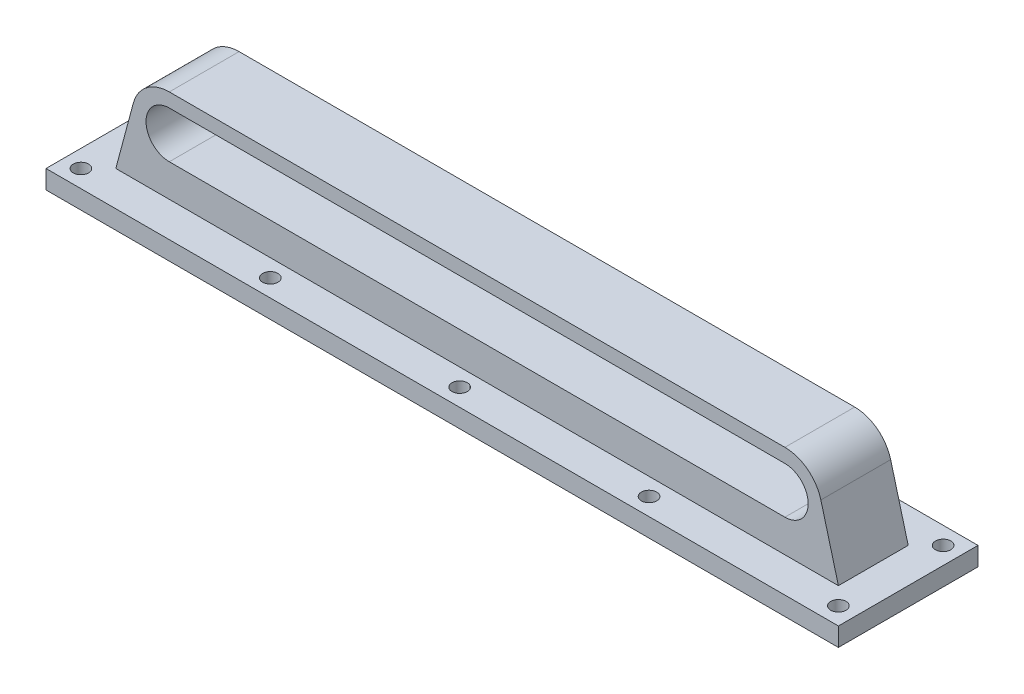
ISO-10303-21;
HEADER;
FILE_DESCRIPTION(('STEP AP214'),'2;1');
FILE_NAME('part.step','',(''),(''),'','','');
FILE_SCHEMA(('AUTOMOTIVE_DESIGN { 1 0 10303 214 1 1 1 1 }'));
ENDSEC;
DATA;
#1=APPLICATION_CONTEXT('core data for automotive mechanical design processes');
#2=APPLICATION_PROTOCOL_DEFINITION('international standard','automotive_design',2000,#1);
#3=PRODUCT_CONTEXT('',#1,'mechanical');
#4=PRODUCT('Part','Part','',(#3));
#5=PRODUCT_RELATED_PRODUCT_CATEGORY('part','',(#4));
#6=PRODUCT_DEFINITION_FORMATION('','',#4);
#7=PRODUCT_DEFINITION_CONTEXT('part definition',#1,'design');
#8=PRODUCT_DEFINITION('design','',#6,#7);
#9=PRODUCT_DEFINITION_SHAPE('','',#8);
#10=(LENGTH_UNIT() NAMED_UNIT(*) SI_UNIT(.MILLI.,.METRE.));
#11=(NAMED_UNIT(*) PLANE_ANGLE_UNIT() SI_UNIT($,.RADIAN.));
#12=(NAMED_UNIT(*) SI_UNIT($,.STERADIAN.) SOLID_ANGLE_UNIT());
#13=UNCERTAINTY_MEASURE_WITH_UNIT(LENGTH_MEASURE(1.E-05),#10,'distance_accuracy_value','');
#14=(GEOMETRIC_REPRESENTATION_CONTEXT(3) GLOBAL_UNCERTAINTY_ASSIGNED_CONTEXT((#13)) GLOBAL_UNIT_ASSIGNED_CONTEXT((#10,
#11,#12)) REPRESENTATION_CONTEXT('',''));
#15=CARTESIAN_POINT('',(0.,0.,0.));
#16=DIRECTION('',(0.,0.,1.));
#17=DIRECTION('',(1.,0.,0.));
#18=AXIS2_PLACEMENT_3D('',#15,#16,#17);
#19=CARTESIAN_POINT('',(132.3,0.,15.));
#20=DIRECTION('',(0.,0.,1.));
#21=DIRECTION('',(1.,0.,0.));
#22=AXIS2_PLACEMENT_3D('',#19,#20,#21);
#23=PLANE('',#22);
#24=DIRECTION('',(-1.,0.,0.));
#25=VECTOR('',#24,1.);
#26=CARTESIAN_POINT('',(170.295199504908,-24.,15.));
#27=LINE('',#26,#25);
#28=CARTESIAN_POINT('',(155.295199504908,-24.,15.));
#29=VERTEX_POINT('',#28);
#30=CARTESIAN_POINT('',(-155.295199504908,-24.,15.));
#31=VERTEX_POINT('',#30);
#32=EDGE_CURVE('E95',#29,#31,#27,.T.);
#33=ORIENTED_EDGE('',*,*,#32,.F.);
#34=DIRECTION('',(-0.258819045102524,0.965925826289067,0.));
#35=VECTOR('',#34,1.);
#36=CARTESIAN_POINT('',(155.295199504908,-24.,15.));
#37=LINE('',#36,#35);
#38=CARTESIAN_POINT('',(147.754813220625,4.14110472164025,15.));
#39=VERTEX_POINT('',#38);
#40=EDGE_CURVE('E282',#29,#39,#37,.T.);
#41=ORIENTED_EDGE('',*,*,#40,.T.);
#42=CARTESIAN_POINT('',(132.3,0.,15.));
#43=DIRECTION('',(0.,0.,1.));
#44=DIRECTION('',(1.,0.,0.));
#45=AXIS2_PLACEMENT_3D('',#42,#43,#44);
#46=CIRCLE('',#45,15.9999999999999);
#47=CARTESIAN_POINT('',(132.3,15.9999999999999,15.));
#48=VERTEX_POINT('',#47);
#49=EDGE_CURVE('E285',#39,#48,#46,.T.);
#50=ORIENTED_EDGE('',*,*,#49,.T.);
#51=DIRECTION('',(1.,0.,0.));
#52=VECTOR('',#51,1.);
#53=CARTESIAN_POINT('',(-132.3,16.,15.));
#54=LINE('',#53,#52);
#55=CARTESIAN_POINT('',(-132.3,16.,15.));
#56=VERTEX_POINT('',#55);
#57=EDGE_CURVE('E289',#56,#48,#54,.T.);
#58=ORIENTED_EDGE('',*,*,#57,.F.);
#59=CARTESIAN_POINT('',(-132.3,0.,15.));
#60=DIRECTION('',(0.,0.,1.));
#61=DIRECTION('',(1.,0.,0.));
#62=AXIS2_PLACEMENT_3D('',#59,#60,#61);
#63=CIRCLE('',#62,15.9999999999999);
#64=CARTESIAN_POINT('',(-147.754813220625,4.14110472164023,15.));
#65=VERTEX_POINT('',#64);
#66=EDGE_CURVE('E293',#56,#65,#63,.T.);
#67=ORIENTED_EDGE('',*,*,#66,.T.);
#68=DIRECTION('',(-0.258819045102524,-0.965925826289067,0.));
#69=VECTOR('',#68,1.);
#70=CARTESIAN_POINT('',(-147.754813220625,4.14110472164021,15.));
#71=LINE('',#70,#69);
#72=EDGE_CURVE('E296',#65,#31,#71,.T.);
#73=ORIENTED_EDGE('',*,*,#72,.T.);
#74=EDGE_LOOP('',(#33,#41,#50,#58,#67,#73));
#75=FACE_BOUND('',#74,.T.);
#76=CARTESIAN_POINT('',(132.3,0.,15.));
#77=DIRECTION('',(0.,0.,1.));
#78=DIRECTION('',(1.,0.,0.));
#79=AXIS2_PLACEMENT_3D('',#76,#77,#78);
#80=CIRCLE('',#79,9.99999999999999);
#81=CARTESIAN_POINT('',(132.3,-9.99999999999993,15.));
#82=VERTEX_POINT('',#81);
#83=CARTESIAN_POINT('',(132.3,10.0000000000001,15.));
#84=VERTEX_POINT('',#83);
#85=EDGE_CURVE('E247',#82,#84,#80,.T.);
#86=ORIENTED_EDGE('',*,*,#85,.F.);
#87=DIRECTION('',(1.,0.,0.));
#88=VECTOR('',#87,1.);
#89=CARTESIAN_POINT('',(0.,-9.99999999999996,15.));
#90=LINE('',#89,#88);
#91=CARTESIAN_POINT('',(-132.3,-9.99999999999999,15.));
#92=VERTEX_POINT('',#91);
#93=EDGE_CURVE('E244',#92,#82,#90,.T.);
#94=ORIENTED_EDGE('',*,*,#93,.F.);
#95=CARTESIAN_POINT('',(-132.3,0.,15.));
#96=DIRECTION('',(0.,0.,1.));
#97=DIRECTION('',(1.,0.,0.));
#98=AXIS2_PLACEMENT_3D('',#95,#96,#97);
#99=CIRCLE('',#98,9.99999999999999);
#100=CARTESIAN_POINT('',(-132.3,9.99999999999998,15.));
#101=VERTEX_POINT('',#100);
#102=EDGE_CURVE('E253',#101,#92,#99,.T.);
#103=ORIENTED_EDGE('',*,*,#102,.F.);
#104=DIRECTION('',(1.,0.,0.));
#105=VECTOR('',#104,1.);
#106=CARTESIAN_POINT('',(0.,10.,15.));
#107=LINE('',#106,#105);
#108=EDGE_CURVE('E103',#101,#84,#107,.T.);
#109=ORIENTED_EDGE('',*,*,#108,.T.);
#110=EDGE_LOOP('',(#86,#94,#103,#109));
#111=FACE_BOUND('',#110,.T.);
#112=ADVANCED_FACE('F85',(#75,#111),#23,.T.);
#113=CARTESIAN_POINT('',(132.3,0.,-15.));
#114=DIRECTION('',(0.,0.,1.));
#115=DIRECTION('',(1.,0.,0.));
#116=AXIS2_PLACEMENT_3D('',#113,#114,#115);
#117=PLANE('',#116);
#118=DIRECTION('',(-0.258819045102524,0.965925826289067,0.));
#119=VECTOR('',#118,1.);
#120=CARTESIAN_POINT('',(155.295199504908,-24.,-15.));
#121=LINE('',#120,#119);
#122=CARTESIAN_POINT('',(155.295199504908,-24.,-15.));
#123=VERTEX_POINT('',#122);
#124=CARTESIAN_POINT('',(147.754813220625,4.14110472164025,-15.));
#125=VERTEX_POINT('',#124);
#126=EDGE_CURVE('E281',#123,#125,#121,.T.);
#127=ORIENTED_EDGE('',*,*,#126,.F.);
#128=DIRECTION('',(-1.,0.,0.));
#129=VECTOR('',#128,1.);
#130=CARTESIAN_POINT('',(170.295199504908,-24.,-15.));
#131=LINE('',#130,#129);
#132=CARTESIAN_POINT('',(-155.295199504908,-24.,-15.));
#133=VERTEX_POINT('',#132);
#134=EDGE_CURVE('E12',#123,#133,#131,.T.);
#135=ORIENTED_EDGE('',*,*,#134,.T.);
#136=DIRECTION('',(-0.258819045102524,-0.965925826289067,0.));
#137=VECTOR('',#136,1.);
#138=CARTESIAN_POINT('',(-147.754813220625,4.14110472164021,-15.));
#139=LINE('',#138,#137);
#140=CARTESIAN_POINT('',(-147.754813220625,4.14110472164023,-15.));
#141=VERTEX_POINT('',#140);
#142=EDGE_CURVE('E286',#141,#133,#139,.T.);
#143=ORIENTED_EDGE('',*,*,#142,.F.);
#144=CARTESIAN_POINT('',(-132.3,0.,-15.));
#145=DIRECTION('',(0.,0.,1.));
#146=DIRECTION('',(1.,0.,0.));
#147=AXIS2_PLACEMENT_3D('',#144,#145,#146);
#148=CIRCLE('',#147,15.9999999999999);
#149=CARTESIAN_POINT('',(-132.3,16.,-15.));
#150=VERTEX_POINT('',#149);
#151=EDGE_CURVE('E310',#150,#141,#148,.T.);
#152=ORIENTED_EDGE('',*,*,#151,.F.);
#153=DIRECTION('',(1.,0.,0.));
#154=VECTOR('',#153,1.);
#155=CARTESIAN_POINT('',(-132.3,16.,-15.));
#156=LINE('',#155,#154);
#157=CARTESIAN_POINT('',(132.3,15.9999999999999,-15.));
#158=VERTEX_POINT('',#157);
#159=EDGE_CURVE('E306',#150,#158,#156,.T.);
#160=ORIENTED_EDGE('',*,*,#159,.T.);
#161=CARTESIAN_POINT('',(132.3,0.,-15.));
#162=DIRECTION('',(0.,0.,1.));
#163=DIRECTION('',(1.,0.,0.));
#164=AXIS2_PLACEMENT_3D('',#161,#162,#163);
#165=CIRCLE('',#164,15.9999999999999);
#166=EDGE_CURVE('E302',#125,#158,#165,.T.);
#167=ORIENTED_EDGE('',*,*,#166,.F.);
#168=EDGE_LOOP('',(#127,#135,#143,#152,#160,#167));
#169=FACE_BOUND('',#168,.T.);
#170=DIRECTION('',(1.,0.,0.));
#171=VECTOR('',#170,1.);
#172=CARTESIAN_POINT('',(0.,-9.99999999999996,-15.));
#173=LINE('',#172,#171);
#174=CARTESIAN_POINT('',(-132.3,-10.,-15.));
#175=VERTEX_POINT('',#174);
#176=CARTESIAN_POINT('',(132.3,-9.99999999999993,-15.));
#177=VERTEX_POINT('',#176);
#178=EDGE_CURVE('E111',#175,#177,#173,.T.);
#179=ORIENTED_EDGE('',*,*,#178,.T.);
#180=CARTESIAN_POINT('',(132.3,0.,-15.));
#181=DIRECTION('',(0.,0.,1.));
#182=DIRECTION('',(1.,0.,0.));
#183=AXIS2_PLACEMENT_3D('',#180,#181,#182);
#184=CIRCLE('',#183,9.99999999999999);
#185=CARTESIAN_POINT('',(132.3,10.0000000000001,-15.));
#186=VERTEX_POINT('',#185);
#187=EDGE_CURVE('E259',#177,#186,#184,.T.);
#188=ORIENTED_EDGE('',*,*,#187,.T.);
#189=DIRECTION('',(1.,0.,0.));
#190=VECTOR('',#189,1.);
#191=CARTESIAN_POINT('',(0.,10.,-15.));
#192=LINE('',#191,#190);
#193=CARTESIAN_POINT('',(-132.3,9.99999999999999,-15.));
#194=VERTEX_POINT('',#193);
#195=EDGE_CURVE('E263',#194,#186,#192,.T.);
#196=ORIENTED_EDGE('',*,*,#195,.F.);
#197=CARTESIAN_POINT('',(-132.3,0.,-15.));
#198=DIRECTION('',(0.,0.,1.));
#199=DIRECTION('',(1.,0.,0.));
#200=AXIS2_PLACEMENT_3D('',#197,#198,#199);
#201=CIRCLE('',#200,9.99999999999999);
#202=EDGE_CURVE('E248',#194,#175,#201,.T.);
#203=ORIENTED_EDGE('',*,*,#202,.T.);
#204=EDGE_LOOP('',(#179,#188,#196,#203));
#205=FACE_BOUND('',#204,.T.);
#206=ADVANCED_FACE('F360',(#169,#205),#117,.F.);
#207=CARTESIAN_POINT('',(-170.295199504908,-24.,15.));
#208=DIRECTION('',(1.,0.,0.));
#209=DIRECTION('',(0.,0.,-1.));
#210=AXIS2_PLACEMENT_3D('',#207,#208,#209);
#211=PLANE('',#210);
#212=DIRECTION('',(0.,0.,-1.));
#213=VECTOR('',#212,1.);
#214=CARTESIAN_POINT('',(-170.295199504908,-24.,15.));
#215=LINE('',#214,#213);
#216=CARTESIAN_POINT('',(-170.295199504908,-24.,30.));
#217=VERTEX_POINT('',#216);
#218=CARTESIAN_POINT('',(-170.295199504908,-24.,-30.));
#219=VERTEX_POINT('',#218);
#220=EDGE_CURVE('E299',#217,#219,#215,.T.);
#221=ORIENTED_EDGE('',*,*,#220,.T.);
#222=DIRECTION('',(0.,-1.,0.));
#223=VECTOR('',#222,1.);
#224=CARTESIAN_POINT('',(-170.295199504908,-24.,-30.));
#225=LINE('',#224,#223);
#226=CARTESIAN_POINT('',(-170.295199504908,-32.,-30.));
#227=VERTEX_POINT('',#226);
#228=EDGE_CURVE('E213',#219,#227,#225,.T.);
#229=ORIENTED_EDGE('',*,*,#228,.T.);
#230=DIRECTION('',(0.,0.,-1.));
#231=VECTOR('',#230,1.);
#232=CARTESIAN_POINT('',(-170.295199504908,-32.,15.));
#233=LINE('',#232,#231);
#234=CARTESIAN_POINT('',(-170.295199504908,-32.,30.));
#235=VERTEX_POINT('',#234);
#236=EDGE_CURVE('E89',#235,#227,#233,.T.);
#237=ORIENTED_EDGE('',*,*,#236,.F.);
#238=DIRECTION('',(0.,-1.,0.));
#239=VECTOR('',#238,1.);
#240=CARTESIAN_POINT('',(-170.295199504908,-24.,30.));
#241=LINE('',#240,#239);
#242=EDGE_CURVE('E240',#217,#235,#241,.T.);
#243=ORIENTED_EDGE('',*,*,#242,.F.);
#244=EDGE_LOOP('',(#221,#229,#237,#243));
#245=FACE_BOUND('',#244,.T.);
#246=ADVANCED_FACE('F87',(#245),#211,.F.);
#247=CARTESIAN_POINT('',(-170.295199504908,-32.,15.));
#248=DIRECTION('',(0.,1.,0.));
#249=DIRECTION('',(-1.,0.,0.));
#250=AXIS2_PLACEMENT_3D('',#247,#248,#249);
#251=PLANE('',#250);
#252=CARTESIAN_POINT('',(-162.795199504908,-32.0000000000002,-22.5));
#253=DIRECTION('',(0.,1.,0.));
#254=DIRECTION('',(0.,0.,1.));
#255=AXIS2_PLACEMENT_3D('',#252,#253,#254);
#256=CIRCLE('',#255,3.3);
#257=CARTESIAN_POINT('',(-162.795199504908,-32.0000000000002,-19.2));
#258=VERTEX_POINT('',#257);
#259=EDGE_CURVE('E405',#258,#258,#256,.T.);
#260=ORIENTED_EDGE('',*,*,#259,.T.);
#261=EDGE_LOOP('',(#260));
#262=FACE_BOUND('',#261,.T.);
#263=CARTESIAN_POINT('',(-162.795199504908,-32.0000000000002,22.5));
#264=DIRECTION('',(0.,1.,0.));
#265=DIRECTION('',(0.,0.,1.));
#266=AXIS2_PLACEMENT_3D('',#263,#264,#265);
#267=CIRCLE('',#266,3.3);
#268=CARTESIAN_POINT('',(-162.795199504908,-32.0000000000002,25.8));
#269=VERTEX_POINT('',#268);
#270=EDGE_CURVE('E409',#269,#269,#267,.T.);
#271=ORIENTED_EDGE('',*,*,#270,.T.);
#272=EDGE_LOOP('',(#271));
#273=FACE_BOUND('',#272,.T.);
#274=CARTESIAN_POINT('',(-81.3975997524541,-32.0000000000002,22.5));
#275=DIRECTION('',(0.,1.,0.));
#276=DIRECTION('',(0.,0.,1.));
#277=AXIS2_PLACEMENT_3D('',#274,#275,#276);
#278=CIRCLE('',#277,3.3);
#279=CARTESIAN_POINT('',(-81.3975997524541,-32.0000000000002,25.8));
#280=VERTEX_POINT('',#279);
#281=EDGE_CURVE('E413',#280,#280,#278,.T.);
#282=ORIENTED_EDGE('',*,*,#281,.T.);
#283=EDGE_LOOP('',(#282));
#284=FACE_BOUND('',#283,.T.);
#285=CARTESIAN_POINT('',(-81.3975997524541,-32.0000000000002,-22.5));
#286=DIRECTION('',(0.,1.,0.));
#287=DIRECTION('',(0.,0.,1.));
#288=AXIS2_PLACEMENT_3D('',#285,#286,#287);
#289=CIRCLE('',#288,3.3);
#290=CARTESIAN_POINT('',(-81.3975997524541,-32.0000000000002,-19.2));
#291=VERTEX_POINT('',#290);
#292=EDGE_CURVE('E417',#291,#291,#289,.T.);
#293=ORIENTED_EDGE('',*,*,#292,.T.);
#294=EDGE_LOOP('',(#293));
#295=FACE_BOUND('',#294,.T.);
#296=CARTESIAN_POINT('',(0.,-32.0000000000002,22.4999999999998));
#297=DIRECTION('',(0.,1.,0.));
#298=DIRECTION('',(0.,0.,1.));
#299=AXIS2_PLACEMENT_3D('',#296,#297,#298);
#300=CIRCLE('',#299,3.3);
#301=CARTESIAN_POINT('',(0.,-32.0000000000002,25.7999999999998));
#302=VERTEX_POINT('',#301);
#303=EDGE_CURVE('E421',#302,#302,#300,.T.);
#304=ORIENTED_EDGE('',*,*,#303,.T.);
#305=EDGE_LOOP('',(#304));
#306=FACE_BOUND('',#305,.T.);
#307=CARTESIAN_POINT('',(0.,-32.0000000000002,-22.5000000000001));
#308=DIRECTION('',(0.,1.,0.));
#309=DIRECTION('',(0.,0.,1.));
#310=AXIS2_PLACEMENT_3D('',#307,#308,#309);
#311=CIRCLE('',#310,3.3);
#312=CARTESIAN_POINT('',(0.,-32.0000000000002,-19.2000000000001));
#313=VERTEX_POINT('',#312);
#314=EDGE_CURVE('E425',#313,#313,#311,.T.);
#315=ORIENTED_EDGE('',*,*,#314,.T.);
#316=EDGE_LOOP('',(#315));
#317=FACE_BOUND('',#316,.T.);
#318=CARTESIAN_POINT('',(81.3975997524541,-32.0000000000002,22.5));
#319=DIRECTION('',(0.,1.,0.));
#320=DIRECTION('',(0.,0.,1.));
#321=AXIS2_PLACEMENT_3D('',#318,#319,#320);
#322=CIRCLE('',#321,3.3);
#323=CARTESIAN_POINT('',(81.3975997524541,-32.0000000000002,25.8));
#324=VERTEX_POINT('',#323);
#325=EDGE_CURVE('E429',#324,#324,#322,.T.);
#326=ORIENTED_EDGE('',*,*,#325,.T.);
#327=EDGE_LOOP('',(#326));
#328=FACE_BOUND('',#327,.T.);
#329=CARTESIAN_POINT('',(81.3975997524541,-32.0000000000002,-22.5000000000001));
#330=DIRECTION('',(0.,1.,0.));
#331=DIRECTION('',(0.,0.,1.));
#332=AXIS2_PLACEMENT_3D('',#329,#330,#331);
#333=CIRCLE('',#332,3.3);
#334=CARTESIAN_POINT('',(81.3975997524541,-32.0000000000002,-19.2000000000001));
#335=VERTEX_POINT('',#334);
#336=EDGE_CURVE('E433',#335,#335,#333,.T.);
#337=ORIENTED_EDGE('',*,*,#336,.T.);
#338=EDGE_LOOP('',(#337));
#339=FACE_BOUND('',#338,.T.);
#340=CARTESIAN_POINT('',(162.795199504908,-32.0000000000001,-22.5000000000001));
#341=DIRECTION('',(0.,1.,0.));
#342=DIRECTION('',(0.,0.,1.));
#343=AXIS2_PLACEMENT_3D('',#340,#341,#342);
#344=CIRCLE('',#343,3.3);
#345=CARTESIAN_POINT('',(162.795199504908,-32.0000000000001,-19.2000000000001));
#346=VERTEX_POINT('',#345);
#347=EDGE_CURVE('E437',#346,#346,#344,.T.);
#348=ORIENTED_EDGE('',*,*,#347,.T.);
#349=EDGE_LOOP('',(#348));
#350=FACE_BOUND('',#349,.T.);
#351=CARTESIAN_POINT('',(162.795199504908,-32.0000000000001,22.5));
#352=DIRECTION('',(0.,1.,0.));
#353=DIRECTION('',(0.,0.,1.));
#354=AXIS2_PLACEMENT_3D('',#351,#352,#353);
#355=CIRCLE('',#354,3.3);
#356=CARTESIAN_POINT('',(162.795199504908,-32.0000000000001,25.8));
#357=VERTEX_POINT('',#356);
#358=EDGE_CURVE('E224',#357,#357,#355,.T.);
#359=ORIENTED_EDGE('',*,*,#358,.T.);
#360=EDGE_LOOP('',(#359));
#361=FACE_BOUND('',#360,.T.);
#362=ORIENTED_EDGE('',*,*,#236,.T.);
#363=DIRECTION('',(1.,0.,0.));
#364=VECTOR('',#363,1.);
#365=CARTESIAN_POINT('',(-170.295199504908,-32.,-30.));
#366=LINE('',#365,#364);
#367=CARTESIAN_POINT('',(170.295199504908,-32.,-30.));
#368=VERTEX_POINT('',#367);
#369=EDGE_CURVE('E219',#227,#368,#366,.T.);
#370=ORIENTED_EDGE('',*,*,#369,.T.);
#371=DIRECTION('',(0.,0.,-1.));
#372=VECTOR('',#371,1.);
#373=CARTESIAN_POINT('',(170.295199504908,-32.,15.));
#374=LINE('',#373,#372);
#375=CARTESIAN_POINT('',(170.295199504908,-32.,30.));
#376=VERTEX_POINT('',#375);
#377=EDGE_CURVE('E202',#376,#368,#374,.T.);
#378=ORIENTED_EDGE('',*,*,#377,.F.);
#379=DIRECTION('',(1.,0.,0.));
#380=VECTOR('',#379,1.);
#381=CARTESIAN_POINT('',(-170.295199504908,-32.,30.));
#382=LINE('',#381,#380);
#383=EDGE_CURVE('E212',#235,#376,#382,.T.);
#384=ORIENTED_EDGE('',*,*,#383,.F.);
#385=EDGE_LOOP('',(#362,#370,#378,#384));
#386=FACE_BOUND('',#385,.T.);
#387=ADVANCED_FACE('F342',(#262,#273,#284,#295,#306,#317,#328,#339,#350,#361,#386),#251,.F.);
#388=CARTESIAN_POINT('',(170.295199504908,-32.,15.));
#389=DIRECTION('',(-1.,0.,0.));
#390=DIRECTION('',(0.,0.,1.));
#391=AXIS2_PLACEMENT_3D('',#388,#389,#390);
#392=PLANE('',#391);
#393=ORIENTED_EDGE('',*,*,#377,.T.);
#394=DIRECTION('',(0.,-1.,0.));
#395=VECTOR('',#394,1.);
#396=CARTESIAN_POINT('',(170.295199504908,-24.,-30.));
#397=LINE('',#396,#395);
#398=CARTESIAN_POINT('',(170.295199504908,-24.,-30.));
#399=VERTEX_POINT('',#398);
#400=EDGE_CURVE('E206',#399,#368,#397,.T.);
#401=ORIENTED_EDGE('',*,*,#400,.F.);
#402=DIRECTION('',(0.,0.,-1.));
#403=VECTOR('',#402,1.);
#404=CARTESIAN_POINT('',(170.295199504908,-24.,15.));
#405=LINE('',#404,#403);
#406=CARTESIAN_POINT('',(170.295199504908,-24.,30.));
#407=VERTEX_POINT('',#406);
#408=EDGE_CURVE('E191',#407,#399,#405,.T.);
#409=ORIENTED_EDGE('',*,*,#408,.F.);
#410=DIRECTION('',(0.,-1.,0.));
#411=VECTOR('',#410,1.);
#412=CARTESIAN_POINT('',(170.295199504908,-24.,30.));
#413=LINE('',#412,#411);
#414=EDGE_CURVE('E234',#407,#376,#413,.T.);
#415=ORIENTED_EDGE('',*,*,#414,.T.);
#416=EDGE_LOOP('',(#393,#401,#409,#415));
#417=FACE_BOUND('',#416,.T.);
#418=ADVANCED_FACE('F207',(#417),#392,.F.);
#419=CARTESIAN_POINT('',(155.295199504908,-24.,15.));
#420=DIRECTION('',(-0.965925826289067,-0.258819045102524,0.));
#421=DIRECTION('',(0.258819045102524,-0.965925826289068,0.));
#422=AXIS2_PLACEMENT_3D('',#419,#420,#421);
#423=PLANE('',#422);
#424=ORIENTED_EDGE('',*,*,#126,.T.);
#425=DIRECTION('',(0.,0.,-1.));
#426=VECTOR('',#425,1.);
#427=CARTESIAN_POINT('',(147.754813220625,4.14110472164025,15.));
#428=LINE('',#427,#426);
#429=EDGE_CURVE('E332',#39,#125,#428,.T.);
#430=ORIENTED_EDGE('',*,*,#429,.F.);
#431=ORIENTED_EDGE('',*,*,#40,.F.);
#432=DIRECTION('',(0.,0.,-1.));
#433=VECTOR('',#432,1.);
#434=CARTESIAN_POINT('',(155.295199504908,-24.,15.));
#435=LINE('',#434,#433);
#436=EDGE_CURVE('E203',#29,#123,#435,.T.);
#437=ORIENTED_EDGE('',*,*,#436,.T.);
#438=EDGE_LOOP('',(#424,#430,#431,#437));
#439=FACE_BOUND('',#438,.T.);
#440=ADVANCED_FACE('F391',(#439),#423,.F.);
#441=CARTESIAN_POINT('',(132.3,0.,15.));
#442=DIRECTION('',(0.,0.,-1.));
#443=DIRECTION('',(-1.,0.,0.));
#444=AXIS2_PLACEMENT_3D('',#441,#442,#443);
#445=CYLINDRICAL_SURFACE('',#444,15.9999999999999);
#446=ORIENTED_EDGE('',*,*,#166,.T.);
#447=DIRECTION('',(0.,0.,-1.));
#448=VECTOR('',#447,1.);
#449=CARTESIAN_POINT('',(132.3,15.9999999999999,15.));
#450=LINE('',#449,#448);
#451=EDGE_CURVE('E329',#48,#158,#450,.T.);
#452=ORIENTED_EDGE('',*,*,#451,.F.);
#453=ORIENTED_EDGE('',*,*,#49,.F.);
#454=ORIENTED_EDGE('',*,*,#429,.T.);
#455=EDGE_LOOP('',(#446,#452,#453,#454));
#456=FACE_BOUND('',#455,.T.);
#457=ADVANCED_FACE('F387',(#456),#445,.T.);
#458=CARTESIAN_POINT('',(-132.3,16.,15.));
#459=DIRECTION('',(0.,1.,0.));
#460=DIRECTION('',(0.,0.,1.));
#461=AXIS2_PLACEMENT_3D('',#458,#459,#460);
#462=PLANE('',#461);
#463=ORIENTED_EDGE('',*,*,#159,.F.);
#464=DIRECTION('',(0.,0.,-1.));
#465=VECTOR('',#464,1.);
#466=CARTESIAN_POINT('',(-132.3,16.,15.));
#467=LINE('',#466,#465);
#468=EDGE_CURVE('E326',#56,#150,#467,.T.);
#469=ORIENTED_EDGE('',*,*,#468,.F.);
#470=ORIENTED_EDGE('',*,*,#57,.T.);
#471=ORIENTED_EDGE('',*,*,#451,.T.);
#472=EDGE_LOOP('',(#463,#469,#470,#471));
#473=FACE_BOUND('',#472,.T.);
#474=ADVANCED_FACE('F383',(#473),#462,.T.);
#475=CARTESIAN_POINT('',(-132.3,0.,15.));
#476=DIRECTION('',(0.,0.,-1.));
#477=DIRECTION('',(-1.,0.,0.));
#478=AXIS2_PLACEMENT_3D('',#475,#476,#477);
#479=CYLINDRICAL_SURFACE('',#478,15.9999999999999);
#480=ORIENTED_EDGE('',*,*,#151,.T.);
#481=DIRECTION('',(0.,0.,-1.));
#482=VECTOR('',#481,1.);
#483=CARTESIAN_POINT('',(-147.754813220625,4.14110472164023,15.));
#484=LINE('',#483,#482);
#485=EDGE_CURVE('E322',#65,#141,#484,.T.);
#486=ORIENTED_EDGE('',*,*,#485,.F.);
#487=ORIENTED_EDGE('',*,*,#66,.F.);
#488=ORIENTED_EDGE('',*,*,#468,.T.);
#489=EDGE_LOOP('',(#480,#486,#487,#488));
#490=FACE_BOUND('',#489,.T.);
#491=ADVANCED_FACE('F379',(#490),#479,.T.);
#492=CARTESIAN_POINT('',(-147.754813220625,4.14110472164021,15.));
#493=DIRECTION('',(0.965925826289067,-0.258819045102524,0.));
#494=DIRECTION('',(0.258819045102524,0.965925826289068,0.));
#495=AXIS2_PLACEMENT_3D('',#492,#493,#494);
#496=PLANE('',#495);
#497=ORIENTED_EDGE('',*,*,#142,.T.);
#498=DIRECTION('',(0.,0.,-1.));
#499=VECTOR('',#498,1.);
#500=CARTESIAN_POINT('',(-155.295199504908,-24.,15.));
#501=LINE('',#500,#499);
#502=EDGE_CURVE('E318',#31,#133,#501,.T.);
#503=ORIENTED_EDGE('',*,*,#502,.F.);
#504=ORIENTED_EDGE('',*,*,#72,.F.);
#505=ORIENTED_EDGE('',*,*,#485,.T.);
#506=EDGE_LOOP('',(#497,#503,#504,#505));
#507=FACE_BOUND('',#506,.T.);
#508=ADVANCED_FACE('F375',(#507),#496,.F.);
#509=CARTESIAN_POINT('',(-155.295199504908,-24.,15.));
#510=DIRECTION('',(0.,-1.,0.));
#511=DIRECTION('',(1.,0.,0.));
#512=AXIS2_PLACEMENT_3D('',#509,#510,#511);
#513=PLANE('',#512);
#514=CARTESIAN_POINT('',(-162.795199504908,-24.,-22.5));
#515=DIRECTION('',(0.,1.,0.));
#516=DIRECTION('',(0.,0.,1.));
#517=AXIS2_PLACEMENT_3D('',#514,#515,#516);
#518=CIRCLE('',#517,3.3);
#519=CARTESIAN_POINT('',(-162.795199504908,-24.,-19.2));
#520=VERTEX_POINT('',#519);
#521=EDGE_CURVE('E498',#520,#520,#518,.T.);
#522=ORIENTED_EDGE('',*,*,#521,.F.);
#523=EDGE_LOOP('',(#522));
#524=FACE_BOUND('',#523,.T.);
#525=CARTESIAN_POINT('',(-162.795199504908,-24.,22.5));
#526=DIRECTION('',(0.,1.,0.));
#527=DIRECTION('',(0.,0.,1.));
#528=AXIS2_PLACEMENT_3D('',#525,#526,#527);
#529=CIRCLE('',#528,3.3);
#530=CARTESIAN_POINT('',(-162.795199504908,-24.,25.8));
#531=VERTEX_POINT('',#530);
#532=EDGE_CURVE('E492',#531,#531,#529,.T.);
#533=ORIENTED_EDGE('',*,*,#532,.F.);
#534=EDGE_LOOP('',(#533));
#535=FACE_BOUND('',#534,.T.);
#536=CARTESIAN_POINT('',(-81.3975997524541,-24.,22.5));
#537=DIRECTION('',(0.,1.,0.));
#538=DIRECTION('',(0.,0.,1.));
#539=AXIS2_PLACEMENT_3D('',#536,#537,#538);
#540=CIRCLE('',#539,3.3);
#541=CARTESIAN_POINT('',(-81.3975997524541,-24.,25.8));
#542=VERTEX_POINT('',#541);
#543=EDGE_CURVE('E486',#542,#542,#540,.T.);
#544=ORIENTED_EDGE('',*,*,#543,.F.);
#545=EDGE_LOOP('',(#544));
#546=FACE_BOUND('',#545,.T.);
#547=CARTESIAN_POINT('',(-81.3975997524541,-24.,-22.5));
#548=DIRECTION('',(0.,1.,0.));
#549=DIRECTION('',(0.,0.,1.));
#550=AXIS2_PLACEMENT_3D('',#547,#548,#549);
#551=CIRCLE('',#550,3.3);
#552=CARTESIAN_POINT('',(-81.3975997524541,-24.,-19.2));
#553=VERTEX_POINT('',#552);
#554=EDGE_CURVE('E480',#553,#553,#551,.T.);
#555=ORIENTED_EDGE('',*,*,#554,.F.);
#556=EDGE_LOOP('',(#555));
#557=FACE_BOUND('',#556,.T.);
#558=CARTESIAN_POINT('',(0.,-24.,22.4999999999998));
#559=DIRECTION('',(0.,1.,0.));
#560=DIRECTION('',(0.,0.,1.));
#561=AXIS2_PLACEMENT_3D('',#558,#559,#560);
#562=CIRCLE('',#561,3.3);
#563=CARTESIAN_POINT('',(0.,-24.,25.7999999999998));
#564=VERTEX_POINT('',#563);
#565=EDGE_CURVE('E474',#564,#564,#562,.T.);
#566=ORIENTED_EDGE('',*,*,#565,.F.);
#567=EDGE_LOOP('',(#566));
#568=FACE_BOUND('',#567,.T.);
#569=CARTESIAN_POINT('',(0.,-24.,-22.5000000000001));
#570=DIRECTION('',(0.,1.,0.));
#571=DIRECTION('',(0.,0.,1.));
#572=AXIS2_PLACEMENT_3D('',#569,#570,#571);
#573=CIRCLE('',#572,3.3);
#574=CARTESIAN_POINT('',(0.,-24.,-19.2000000000001));
#575=VERTEX_POINT('',#574);
#576=EDGE_CURVE('E468',#575,#575,#573,.T.);
#577=ORIENTED_EDGE('',*,*,#576,.F.);
#578=EDGE_LOOP('',(#577));
#579=FACE_BOUND('',#578,.T.);
#580=CARTESIAN_POINT('',(81.3975997524541,-24.,22.5));
#581=DIRECTION('',(0.,1.,0.));
#582=DIRECTION('',(0.,0.,1.));
#583=AXIS2_PLACEMENT_3D('',#580,#581,#582);
#584=CIRCLE('',#583,3.3);
#585=CARTESIAN_POINT('',(81.3975997524541,-24.,25.8));
#586=VERTEX_POINT('',#585);
#587=EDGE_CURVE('E462',#586,#586,#584,.T.);
#588=ORIENTED_EDGE('',*,*,#587,.F.);
#589=EDGE_LOOP('',(#588));
#590=FACE_BOUND('',#589,.T.);
#591=CARTESIAN_POINT('',(81.3975997524541,-24.,-22.5000000000001));
#592=DIRECTION('',(0.,1.,0.));
#593=DIRECTION('',(0.,0.,1.));
#594=AXIS2_PLACEMENT_3D('',#591,#592,#593);
#595=CIRCLE('',#594,3.3);
#596=CARTESIAN_POINT('',(81.3975997524541,-24.,-19.2000000000001));
#597=VERTEX_POINT('',#596);
#598=EDGE_CURVE('E456',#597,#597,#595,.T.);
#599=ORIENTED_EDGE('',*,*,#598,.F.);
#600=EDGE_LOOP('',(#599));
#601=FACE_BOUND('',#600,.T.);
#602=CARTESIAN_POINT('',(162.795199504908,-23.9999999999999,-22.5000000000001));
#603=DIRECTION('',(0.,1.,0.));
#604=DIRECTION('',(0.,0.,1.));
#605=AXIS2_PLACEMENT_3D('',#602,#603,#604);
#606=CIRCLE('',#605,3.3);
#607=CARTESIAN_POINT('',(162.795199504908,-23.9999999999999,-19.2000000000001));
#608=VERTEX_POINT('',#607);
#609=EDGE_CURVE('E448',#608,#608,#606,.T.);
#610=ORIENTED_EDGE('',*,*,#609,.F.);
#611=EDGE_LOOP('',(#610));
#612=FACE_BOUND('',#611,.T.);
#613=CARTESIAN_POINT('',(162.795199504908,-23.9999999999999,22.5));
#614=DIRECTION('',(0.,1.,0.));
#615=DIRECTION('',(0.,0.,1.));
#616=AXIS2_PLACEMENT_3D('',#613,#614,#615);
#617=CIRCLE('',#616,3.3);
#618=CARTESIAN_POINT('',(162.795199504908,-23.9999999999999,25.8));
#619=VERTEX_POINT('',#618);
#620=EDGE_CURVE('E442',#619,#619,#617,.T.);
#621=ORIENTED_EDGE('',*,*,#620,.F.);
#622=EDGE_LOOP('',(#621));
#623=FACE_BOUND('',#622,.T.);
#624=ORIENTED_EDGE('',*,*,#134,.F.);
#625=ORIENTED_EDGE('',*,*,#436,.F.);
#626=ORIENTED_EDGE('',*,*,#32,.T.);
#627=ORIENTED_EDGE('',*,*,#502,.T.);
#628=EDGE_LOOP('',(#624,#625,#626,#627));
#629=FACE_BOUND('',#628,.T.);
#630=ORIENTED_EDGE('',*,*,#408,.T.);
#631=DIRECTION('',(1.,0.,0.));
#632=VECTOR('',#631,1.);
#633=CARTESIAN_POINT('',(-170.295199504908,-24.,-30.));
#634=LINE('',#633,#632);
#635=EDGE_CURVE('E195',#219,#399,#634,.T.);
#636=ORIENTED_EDGE('',*,*,#635,.F.);
#637=ORIENTED_EDGE('',*,*,#220,.F.);
#638=DIRECTION('',(1.,0.,0.));
#639=VECTOR('',#638,1.);
#640=CARTESIAN_POINT('',(-170.295199504908,-24.,30.));
#641=LINE('',#640,#639);
#642=EDGE_CURVE('E197',#217,#407,#641,.T.);
#643=ORIENTED_EDGE('',*,*,#642,.T.);
#644=EDGE_LOOP('',(#630,#636,#637,#643));
#645=FACE_BOUND('',#644,.T.);
#646=ADVANCED_FACE('F193',(#524,#535,#546,#557,#568,#579,#590,#601,#612,#623,#629,#645),#513,.F.);
#647=CARTESIAN_POINT('',(0.,-9.99999999999996,15.));
#648=DIRECTION('',(0.,1.,0.));
#649=DIRECTION('',(-1.,0.,0.));
#650=AXIS2_PLACEMENT_3D('',#647,#648,#649);
#651=PLANE('',#650);
#652=ORIENTED_EDGE('',*,*,#178,.F.);
#653=DIRECTION('',(0.,0.,-1.));
#654=VECTOR('',#653,1.);
#655=CARTESIAN_POINT('',(-132.3,-9.99999999999999,15.));
#656=LINE('',#655,#654);
#657=EDGE_CURVE('E256',#92,#175,#656,.T.);
#658=ORIENTED_EDGE('',*,*,#657,.F.);
#659=ORIENTED_EDGE('',*,*,#93,.T.);
#660=DIRECTION('',(0.,0.,-1.));
#661=VECTOR('',#660,1.);
#662=CARTESIAN_POINT('',(132.3,-9.99999999999993,15.));
#663=LINE('',#662,#661);
#664=EDGE_CURVE('E278',#82,#177,#663,.T.);
#665=ORIENTED_EDGE('',*,*,#664,.T.);
#666=EDGE_LOOP('',(#652,#658,#659,#665));
#667=FACE_BOUND('',#666,.T.);
#668=ADVANCED_FACE('F370',(#667),#651,.T.);
#669=CARTESIAN_POINT('',(132.3,0.,15.));
#670=DIRECTION('',(0.,0.,-1.));
#671=DIRECTION('',(-1.,0.,0.));
#672=AXIS2_PLACEMENT_3D('',#669,#670,#671);
#673=CYLINDRICAL_SURFACE('',#672,9.99999999999999);
#674=ORIENTED_EDGE('',*,*,#187,.F.);
#675=ORIENTED_EDGE('',*,*,#664,.F.);
#676=ORIENTED_EDGE('',*,*,#85,.T.);
#677=DIRECTION('',(0.,0.,-1.));
#678=VECTOR('',#677,1.);
#679=CARTESIAN_POINT('',(132.3,10.0000000000001,15.));
#680=LINE('',#679,#678);
#681=EDGE_CURVE('E275',#84,#186,#680,.T.);
#682=ORIENTED_EDGE('',*,*,#681,.T.);
#683=EDGE_LOOP('',(#674,#675,#676,#682));
#684=FACE_BOUND('',#683,.T.);
#685=ADVANCED_FACE('F545',(#684),#673,.F.);
#686=CARTESIAN_POINT('',(0.,10.,15.));
#687=DIRECTION('',(0.,1.,0.));
#688=DIRECTION('',(-1.,0.,0.));
#689=AXIS2_PLACEMENT_3D('',#686,#687,#688);
#690=PLANE('',#689);
#691=ORIENTED_EDGE('',*,*,#195,.T.);
#692=ORIENTED_EDGE('',*,*,#681,.F.);
#693=ORIENTED_EDGE('',*,*,#108,.F.);
#694=DIRECTION('',(0.,0.,-1.));
#695=VECTOR('',#694,1.);
#696=CARTESIAN_POINT('',(-132.3,9.99999999999999,15.));
#697=LINE('',#696,#695);
#698=EDGE_CURVE('E272',#101,#194,#697,.T.);
#699=ORIENTED_EDGE('',*,*,#698,.T.);
#700=EDGE_LOOP('',(#691,#692,#693,#699));
#701=FACE_BOUND('',#700,.T.);
#702=ADVANCED_FACE('F356',(#701),#690,.F.);
#703=CARTESIAN_POINT('',(-132.3,0.,15.));
#704=DIRECTION('',(0.,0.,-1.));
#705=DIRECTION('',(-1.,0.,0.));
#706=AXIS2_PLACEMENT_3D('',#703,#704,#705);
#707=CYLINDRICAL_SURFACE('',#706,9.99999999999999);
#708=ORIENTED_EDGE('',*,*,#202,.F.);
#709=ORIENTED_EDGE('',*,*,#698,.F.);
#710=ORIENTED_EDGE('',*,*,#102,.T.);
#711=ORIENTED_EDGE('',*,*,#657,.T.);
#712=EDGE_LOOP('',(#708,#709,#710,#711));
#713=FACE_BOUND('',#712,.T.);
#714=ADVANCED_FACE('F348',(#713),#707,.F.);
#715=CARTESIAN_POINT('',(-170.295199504908,-24.,30.));
#716=DIRECTION('',(0.,0.,-1.));
#717=DIRECTION('',(-1.,0.,0.));
#718=AXIS2_PLACEMENT_3D('',#715,#716,#717);
#719=PLANE('',#718);
#720=ORIENTED_EDGE('',*,*,#383,.T.);
#721=ORIENTED_EDGE('',*,*,#414,.F.);
#722=ORIENTED_EDGE('',*,*,#642,.F.);
#723=ORIENTED_EDGE('',*,*,#242,.T.);
#724=EDGE_LOOP('',(#720,#721,#722,#723));
#725=FACE_BOUND('',#724,.T.);
#726=ADVANCED_FACE('F346',(#725),#719,.F.);
#727=CARTESIAN_POINT('',(-170.295199504908,-24.,-30.));
#728=DIRECTION('',(0.,0.,-1.));
#729=DIRECTION('',(-1.,0.,0.));
#730=AXIS2_PLACEMENT_3D('',#727,#728,#729);
#731=PLANE('',#730);
#732=ORIENTED_EDGE('',*,*,#369,.F.);
#733=ORIENTED_EDGE('',*,*,#228,.F.);
#734=ORIENTED_EDGE('',*,*,#635,.T.);
#735=ORIENTED_EDGE('',*,*,#400,.T.);
#736=EDGE_LOOP('',(#732,#733,#734,#735));
#737=FACE_BOUND('',#736,.T.);
#738=ADVANCED_FACE('F216',(#737),#731,.T.);
#739=CARTESIAN_POINT('',(162.795199504908,-23.9999999999999,22.5));
#740=DIRECTION('',(0.,1.,0.));
#741=DIRECTION('',(0.,0.,1.));
#742=AXIS2_PLACEMENT_3D('',#739,#740,#741);
#743=CYLINDRICAL_SURFACE('',#742,3.3);
#744=ORIENTED_EDGE('',*,*,#358,.F.);
#745=EDGE_LOOP('',(#744));
#746=FACE_BOUND('',#745,.T.);
#747=ORIENTED_EDGE('',*,*,#620,.T.);
#748=EDGE_LOOP('',(#747));
#749=FACE_BOUND('',#748,.T.);
#750=ADVANCED_FACE('F354',(#746,#749),#743,.F.);
#751=CARTESIAN_POINT('',(162.795199504908,-23.9999999999999,-22.5000000000001));
#752=DIRECTION('',(0.,1.,0.));
#753=DIRECTION('',(0.,0.,1.));
#754=AXIS2_PLACEMENT_3D('',#751,#752,#753);
#755=CYLINDRICAL_SURFACE('',#754,3.3);
#756=ORIENTED_EDGE('',*,*,#347,.F.);
#757=EDGE_LOOP('',(#756));
#758=FACE_BOUND('',#757,.T.);
#759=ORIENTED_EDGE('',*,*,#609,.T.);
#760=EDGE_LOOP('',(#759));
#761=FACE_BOUND('',#760,.T.);
#762=ADVANCED_FACE('F704',(#758,#761),#755,.F.);
#763=CARTESIAN_POINT('',(81.3975997524541,-24.,-22.5000000000001));
#764=DIRECTION('',(0.,1.,0.));
#765=DIRECTION('',(0.,0.,1.));
#766=AXIS2_PLACEMENT_3D('',#763,#764,#765);
#767=CYLINDRICAL_SURFACE('',#766,3.3);
#768=ORIENTED_EDGE('',*,*,#336,.F.);
#769=EDGE_LOOP('',(#768));
#770=FACE_BOUND('',#769,.T.);
#771=ORIENTED_EDGE('',*,*,#598,.T.);
#772=EDGE_LOOP('',(#771));
#773=FACE_BOUND('',#772,.T.);
#774=ADVANCED_FACE('F710',(#770,#773),#767,.F.);
#775=CARTESIAN_POINT('',(81.3975997524541,-24.,22.5));
#776=DIRECTION('',(0.,1.,0.));
#777=DIRECTION('',(0.,0.,1.));
#778=AXIS2_PLACEMENT_3D('',#775,#776,#777);
#779=CYLINDRICAL_SURFACE('',#778,3.3);
#780=ORIENTED_EDGE('',*,*,#325,.F.);
#781=EDGE_LOOP('',(#780));
#782=FACE_BOUND('',#781,.T.);
#783=ORIENTED_EDGE('',*,*,#587,.T.);
#784=EDGE_LOOP('',(#783));
#785=FACE_BOUND('',#784,.T.);
#786=ADVANCED_FACE('F718',(#782,#785),#779,.F.);
#787=CARTESIAN_POINT('',(0.,-24.,-22.5000000000001));
#788=DIRECTION('',(0.,1.,0.));
#789=DIRECTION('',(0.,0.,1.));
#790=AXIS2_PLACEMENT_3D('',#787,#788,#789);
#791=CYLINDRICAL_SURFACE('',#790,3.3);
#792=ORIENTED_EDGE('',*,*,#314,.F.);
#793=EDGE_LOOP('',(#792));
#794=FACE_BOUND('',#793,.T.);
#795=ORIENTED_EDGE('',*,*,#576,.T.);
#796=EDGE_LOOP('',(#795));
#797=FACE_BOUND('',#796,.T.);
#798=ADVANCED_FACE('F726',(#794,#797),#791,.F.);
#799=CARTESIAN_POINT('',(0.,-24.,22.4999999999998));
#800=DIRECTION('',(0.,1.,0.));
#801=DIRECTION('',(0.,0.,1.));
#802=AXIS2_PLACEMENT_3D('',#799,#800,#801);
#803=CYLINDRICAL_SURFACE('',#802,3.3);
#804=ORIENTED_EDGE('',*,*,#303,.F.);
#805=EDGE_LOOP('',(#804));
#806=FACE_BOUND('',#805,.T.);
#807=ORIENTED_EDGE('',*,*,#565,.T.);
#808=EDGE_LOOP('',(#807));
#809=FACE_BOUND('',#808,.T.);
#810=ADVANCED_FACE('F734',(#806,#809),#803,.F.);
#811=CARTESIAN_POINT('',(-81.3975997524541,-24.,-22.5));
#812=DIRECTION('',(0.,1.,0.));
#813=DIRECTION('',(0.,0.,1.));
#814=AXIS2_PLACEMENT_3D('',#811,#812,#813);
#815=CYLINDRICAL_SURFACE('',#814,3.3);
#816=ORIENTED_EDGE('',*,*,#292,.F.);
#817=EDGE_LOOP('',(#816));
#818=FACE_BOUND('',#817,.T.);
#819=ORIENTED_EDGE('',*,*,#554,.T.);
#820=EDGE_LOOP('',(#819));
#821=FACE_BOUND('',#820,.T.);
#822=ADVANCED_FACE('F742',(#818,#821),#815,.F.);
#823=CARTESIAN_POINT('',(-81.3975997524541,-24.,22.5));
#824=DIRECTION('',(0.,1.,0.));
#825=DIRECTION('',(0.,0.,1.));
#826=AXIS2_PLACEMENT_3D('',#823,#824,#825);
#827=CYLINDRICAL_SURFACE('',#826,3.3);
#828=ORIENTED_EDGE('',*,*,#281,.F.);
#829=EDGE_LOOP('',(#828));
#830=FACE_BOUND('',#829,.T.);
#831=ORIENTED_EDGE('',*,*,#543,.T.);
#832=EDGE_LOOP('',(#831));
#833=FACE_BOUND('',#832,.T.);
#834=ADVANCED_FACE('F750',(#830,#833),#827,.F.);
#835=CARTESIAN_POINT('',(-162.795199504908,-24.,22.5));
#836=DIRECTION('',(0.,1.,0.));
#837=DIRECTION('',(0.,0.,1.));
#838=AXIS2_PLACEMENT_3D('',#835,#836,#837);
#839=CYLINDRICAL_SURFACE('',#838,3.3);
#840=ORIENTED_EDGE('',*,*,#270,.F.);
#841=EDGE_LOOP('',(#840));
#842=FACE_BOUND('',#841,.T.);
#843=ORIENTED_EDGE('',*,*,#532,.T.);
#844=EDGE_LOOP('',(#843));
#845=FACE_BOUND('',#844,.T.);
#846=ADVANCED_FACE('F758',(#842,#845),#839,.F.);
#847=CARTESIAN_POINT('',(-162.795199504908,-24.,-22.5));
#848=DIRECTION('',(0.,1.,0.));
#849=DIRECTION('',(0.,0.,1.));
#850=AXIS2_PLACEMENT_3D('',#847,#848,#849);
#851=CYLINDRICAL_SURFACE('',#850,3.3);
#852=ORIENTED_EDGE('',*,*,#259,.F.);
#853=EDGE_LOOP('',(#852));
#854=FACE_BOUND('',#853,.T.);
#855=ORIENTED_EDGE('',*,*,#521,.T.);
#856=EDGE_LOOP('',(#855));
#857=FACE_BOUND('',#856,.T.);
#858=ADVANCED_FACE('F503',(#854,#857),#851,.F.);
#859=CLOSED_SHELL('',(#112,#206,#246,#387,#418,#440,#457,#474,#491,#508,#646,#668,#685,#702,
#714,#726,#738,#750,#762,#774,#786,#798,#810,#822,#834,#846,#858));
#860=MANIFOLD_SOLID_BREP('B2',#859);
#861=ADVANCED_BREP_SHAPE_REPRESENTATION('',(#18,#860),#14);
#862=SHAPE_DEFINITION_REPRESENTATION(#9,#861);
ENDSEC;
END-ISO-10303-21;
